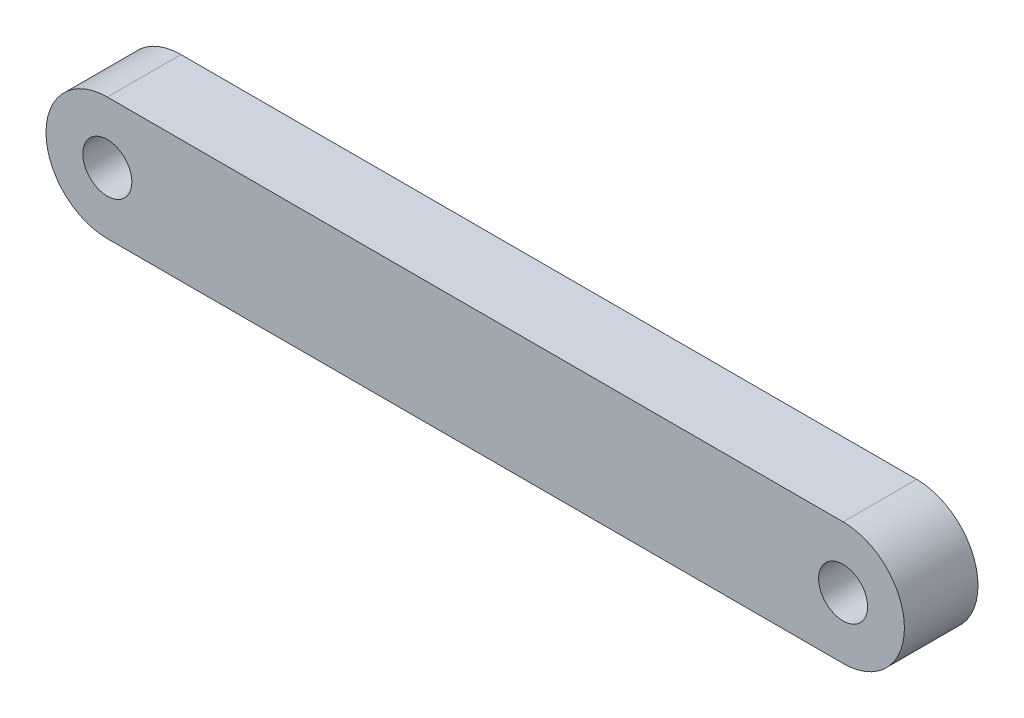
ISO-10303-21;
HEADER;
FILE_DESCRIPTION(('STEP AP214'),'2;1');
FILE_NAME('part.step','',(''),(''),'','','');
FILE_SCHEMA(('AUTOMOTIVE_DESIGN { 1 0 10303 214 1 1 1 1 }'));
ENDSEC;
DATA;
#1=APPLICATION_CONTEXT('core data for automotive mechanical design processes');
#2=APPLICATION_PROTOCOL_DEFINITION('international standard','automotive_design',2000,#1);
#3=PRODUCT_CONTEXT('',#1,'mechanical');
#4=PRODUCT('Part','Part','',(#3));
#5=PRODUCT_RELATED_PRODUCT_CATEGORY('part','',(#4));
#6=PRODUCT_DEFINITION_FORMATION('','',#4);
#7=PRODUCT_DEFINITION_CONTEXT('part definition',#1,'design');
#8=PRODUCT_DEFINITION('design','',#6,#7);
#9=PRODUCT_DEFINITION_SHAPE('','',#8);
#10=(LENGTH_UNIT() NAMED_UNIT(*) SI_UNIT(.MILLI.,.METRE.));
#11=(NAMED_UNIT(*) PLANE_ANGLE_UNIT() SI_UNIT($,.RADIAN.));
#12=(NAMED_UNIT(*) SI_UNIT($,.STERADIAN.) SOLID_ANGLE_UNIT());
#13=UNCERTAINTY_MEASURE_WITH_UNIT(LENGTH_MEASURE(1.E-05),#10,'distance_accuracy_value','');
#14=(GEOMETRIC_REPRESENTATION_CONTEXT(3) GLOBAL_UNCERTAINTY_ASSIGNED_CONTEXT((#13)) GLOBAL_UNIT_ASSIGNED_CONTEXT((#10,
#11,#12)) REPRESENTATION_CONTEXT('',''));
#15=CARTESIAN_POINT('',(0.,0.,0.));
#16=DIRECTION('',(0.,0.,1.));
#17=DIRECTION('',(1.,0.,0.));
#18=AXIS2_PLACEMENT_3D('',#15,#16,#17);
#19=CARTESIAN_POINT('',(0.,0.,3.));
#20=DIRECTION('',(0.,0.,1.));
#21=DIRECTION('',(1.,0.,0.));
#22=AXIS2_PLACEMENT_3D('',#19,#20,#21);
#23=PLANE('',#22);
#24=CARTESIAN_POINT('',(0.,0.,3.));
#25=DIRECTION('',(0.,0.,1.));
#26=DIRECTION('',(1.,0.,0.));
#27=AXIS2_PLACEMENT_3D('',#24,#25,#26);
#28=CIRCLE('',#27,1.);
#29=CARTESIAN_POINT('',(1.,0.,3.));
#30=VERTEX_POINT('',#29);
#31=EDGE_CURVE('E104',#30,#30,#28,.T.);
#32=ORIENTED_EDGE('',*,*,#31,.F.);
#33=EDGE_LOOP('',(#32));
#34=FACE_BOUND('',#33,.T.);
#35=CARTESIAN_POINT('',(0.,0.,3.));
#36=DIRECTION('',(0.,0.,1.));
#37=DIRECTION('',(1.,0.,0.));
#38=AXIS2_PLACEMENT_3D('',#35,#36,#37);
#39=CIRCLE('',#38,2.5);
#40=CARTESIAN_POINT('',(0.,2.5,3.));
#41=VERTEX_POINT('',#40);
#42=CARTESIAN_POINT('',(0.,-2.5,3.));
#43=VERTEX_POINT('',#42);
#44=EDGE_CURVE('E89',#41,#43,#39,.T.);
#45=ORIENTED_EDGE('',*,*,#44,.T.);
#46=DIRECTION('',(1.,0.,0.));
#47=VECTOR('',#46,1.);
#48=CARTESIAN_POINT('',(0.,-2.5,3.));
#49=LINE('',#48,#47);
#50=CARTESIAN_POINT('',(30.,-2.5,3.));
#51=VERTEX_POINT('',#50);
#52=EDGE_CURVE('E84',#43,#51,#49,.T.);
#53=ORIENTED_EDGE('',*,*,#52,.T.);
#54=CARTESIAN_POINT('',(30.,0.,3.));
#55=DIRECTION('',(0.,0.,1.));
#56=DIRECTION('',(1.,0.,0.));
#57=AXIS2_PLACEMENT_3D('',#54,#55,#56);
#58=CIRCLE('',#57,2.5);
#59=CARTESIAN_POINT('',(30.,2.5,3.));
#60=VERTEX_POINT('',#59);
#61=EDGE_CURVE('E87',#51,#60,#58,.T.);
#62=ORIENTED_EDGE('',*,*,#61,.T.);
#63=DIRECTION('',(-1.,0.,0.));
#64=VECTOR('',#63,1.);
#65=CARTESIAN_POINT('',(0.,2.5,3.));
#66=LINE('',#65,#64);
#67=EDGE_CURVE('E54',#60,#41,#66,.T.);
#68=ORIENTED_EDGE('',*,*,#67,.T.);
#69=EDGE_LOOP('',(#45,#53,#62,#68));
#70=FACE_BOUND('',#69,.T.);
#71=CARTESIAN_POINT('',(30.,0.,3.));
#72=DIRECTION('',(0.,0.,1.));
#73=DIRECTION('',(1.,0.,0.));
#74=AXIS2_PLACEMENT_3D('',#71,#72,#73);
#75=CIRCLE('',#74,1.);
#76=CARTESIAN_POINT('',(31.,0.,3.));
#77=VERTEX_POINT('',#76);
#78=EDGE_CURVE('E119',#77,#77,#75,.T.);
#79=ORIENTED_EDGE('',*,*,#78,.F.);
#80=EDGE_LOOP('',(#79));
#81=FACE_BOUND('',#80,.T.);
#82=ADVANCED_FACE('F37',(#34,#70,#81),#23,.T.);
#83=CARTESIAN_POINT('',(0.,0.,0.));
#84=DIRECTION('',(0.,0.,1.));
#85=DIRECTION('',(1.,0.,0.));
#86=AXIS2_PLACEMENT_3D('',#83,#84,#85);
#87=PLANE('',#86);
#88=CARTESIAN_POINT('',(0.,0.,0.));
#89=DIRECTION('',(0.,0.,1.));
#90=DIRECTION('',(1.,0.,0.));
#91=AXIS2_PLACEMENT_3D('',#88,#89,#90);
#92=CIRCLE('',#91,2.5);
#93=CARTESIAN_POINT('',(0.,2.5,0.));
#94=VERTEX_POINT('',#93);
#95=CARTESIAN_POINT('',(0.,-2.5,0.));
#96=VERTEX_POINT('',#95);
#97=EDGE_CURVE('E101',#94,#96,#92,.T.);
#98=ORIENTED_EDGE('',*,*,#97,.F.);
#99=DIRECTION('',(-1.,0.,0.));
#100=VECTOR('',#99,1.);
#101=CARTESIAN_POINT('',(0.,2.5,0.));
#102=LINE('',#101,#100);
#103=CARTESIAN_POINT('',(30.,2.5,0.));
#104=VERTEX_POINT('',#103);
#105=EDGE_CURVE('E77',#104,#94,#102,.T.);
#106=ORIENTED_EDGE('',*,*,#105,.F.);
#107=CARTESIAN_POINT('',(30.,0.,0.));
#108=DIRECTION('',(0.,0.,1.));
#109=DIRECTION('',(1.,0.,0.));
#110=AXIS2_PLACEMENT_3D('',#107,#108,#109);
#111=CIRCLE('',#110,2.5);
#112=CARTESIAN_POINT('',(30.,-2.5,0.));
#113=VERTEX_POINT('',#112);
#114=EDGE_CURVE('E71',#113,#104,#111,.T.);
#115=ORIENTED_EDGE('',*,*,#114,.F.);
#116=DIRECTION('',(1.,0.,0.));
#117=VECTOR('',#116,1.);
#118=CARTESIAN_POINT('',(0.,-2.5,0.));
#119=LINE('',#118,#117);
#120=EDGE_CURVE('E93',#96,#113,#119,.T.);
#121=ORIENTED_EDGE('',*,*,#120,.F.);
#122=EDGE_LOOP('',(#98,#106,#115,#121));
#123=FACE_BOUND('',#122,.T.);
#124=CARTESIAN_POINT('',(0.,0.,0.));
#125=DIRECTION('',(0.,0.,1.));
#126=DIRECTION('',(1.,0.,0.));
#127=AXIS2_PLACEMENT_3D('',#124,#125,#126);
#128=CIRCLE('',#127,1.);
#129=CARTESIAN_POINT('',(1.,0.,0.));
#130=VERTEX_POINT('',#129);
#131=EDGE_CURVE('E116',#130,#130,#128,.T.);
#132=ORIENTED_EDGE('',*,*,#131,.T.);
#133=EDGE_LOOP('',(#132));
#134=FACE_BOUND('',#133,.T.);
#135=CARTESIAN_POINT('',(30.,0.,0.));
#136=DIRECTION('',(0.,0.,1.));
#137=DIRECTION('',(1.,0.,0.));
#138=AXIS2_PLACEMENT_3D('',#135,#136,#137);
#139=CIRCLE('',#138,1.);
#140=CARTESIAN_POINT('',(31.,0.,0.));
#141=VERTEX_POINT('',#140);
#142=EDGE_CURVE('E122',#141,#141,#139,.T.);
#143=ORIENTED_EDGE('',*,*,#142,.T.);
#144=EDGE_LOOP('',(#143));
#145=FACE_BOUND('',#144,.T.);
#146=ADVANCED_FACE('F112',(#123,#134,#145),#87,.F.);
#147=CARTESIAN_POINT('',(0.,0.,3.));
#148=DIRECTION('',(0.,0.,-1.));
#149=DIRECTION('',(-1.,0.,0.));
#150=AXIS2_PLACEMENT_3D('',#147,#148,#149);
#151=CYLINDRICAL_SURFACE('',#150,2.5);
#152=ORIENTED_EDGE('',*,*,#97,.T.);
#153=DIRECTION('',(0.,0.,-1.));
#154=VECTOR('',#153,1.);
#155=CARTESIAN_POINT('',(0.,-2.5,3.));
#156=LINE('',#155,#154);
#157=EDGE_CURVE('E11',#43,#96,#156,.T.);
#158=ORIENTED_EDGE('',*,*,#157,.F.);
#159=ORIENTED_EDGE('',*,*,#44,.F.);
#160=DIRECTION('',(0.,0.,-1.));
#161=VECTOR('',#160,1.);
#162=CARTESIAN_POINT('',(0.,2.5,3.));
#163=LINE('',#162,#161);
#164=EDGE_CURVE('E97',#41,#94,#163,.T.);
#165=ORIENTED_EDGE('',*,*,#164,.T.);
#166=EDGE_LOOP('',(#152,#158,#159,#165));
#167=FACE_BOUND('',#166,.T.);
#168=ADVANCED_FACE('F39',(#167),#151,.T.);
#169=CARTESIAN_POINT('',(0.,-2.5,3.));
#170=DIRECTION('',(0.,1.,0.));
#171=DIRECTION('',(-1.,0.,0.));
#172=AXIS2_PLACEMENT_3D('',#169,#170,#171);
#173=PLANE('',#172);
#174=ORIENTED_EDGE('',*,*,#120,.T.);
#175=DIRECTION('',(0.,0.,-1.));
#176=VECTOR('',#175,1.);
#177=CARTESIAN_POINT('',(30.,-2.5,3.));
#178=LINE('',#177,#176);
#179=EDGE_CURVE('E46',#51,#113,#178,.T.);
#180=ORIENTED_EDGE('',*,*,#179,.F.);
#181=ORIENTED_EDGE('',*,*,#52,.F.);
#182=ORIENTED_EDGE('',*,*,#157,.T.);
#183=EDGE_LOOP('',(#174,#180,#181,#182));
#184=FACE_BOUND('',#183,.T.);
#185=ADVANCED_FACE('F92',(#184),#173,.F.);
#186=CARTESIAN_POINT('',(30.,0.,3.));
#187=DIRECTION('',(0.,0.,-1.));
#188=DIRECTION('',(-1.,0.,0.));
#189=AXIS2_PLACEMENT_3D('',#186,#187,#188);
#190=CYLINDRICAL_SURFACE('',#189,2.5);
#191=ORIENTED_EDGE('',*,*,#114,.T.);
#192=DIRECTION('',(0.,0.,-1.));
#193=VECTOR('',#192,1.);
#194=CARTESIAN_POINT('',(30.,2.5,3.));
#195=LINE('',#194,#193);
#196=EDGE_CURVE('E94',#60,#104,#195,.T.);
#197=ORIENTED_EDGE('',*,*,#196,.F.);
#198=ORIENTED_EDGE('',*,*,#61,.F.);
#199=ORIENTED_EDGE('',*,*,#179,.T.);
#200=EDGE_LOOP('',(#191,#197,#198,#199));
#201=FACE_BOUND('',#200,.T.);
#202=ADVANCED_FACE('F95',(#201),#190,.T.);
#203=CARTESIAN_POINT('',(0.,2.5,3.));
#204=DIRECTION('',(0.,-1.,0.));
#205=DIRECTION('',(1.,0.,0.));
#206=AXIS2_PLACEMENT_3D('',#203,#204,#205);
#207=PLANE('',#206);
#208=ORIENTED_EDGE('',*,*,#105,.T.);
#209=ORIENTED_EDGE('',*,*,#164,.F.);
#210=ORIENTED_EDGE('',*,*,#67,.F.);
#211=ORIENTED_EDGE('',*,*,#196,.T.);
#212=EDGE_LOOP('',(#208,#209,#210,#211));
#213=FACE_BOUND('',#212,.T.);
#214=ADVANCED_FACE('F109',(#213),#207,.F.);
#215=CARTESIAN_POINT('',(0.,0.,3.));
#216=DIRECTION('',(0.,0.,-1.));
#217=DIRECTION('',(-1.,0.,0.));
#218=AXIS2_PLACEMENT_3D('',#215,#216,#217);
#219=CYLINDRICAL_SURFACE('',#218,1.);
#220=ORIENTED_EDGE('',*,*,#31,.T.);
#221=EDGE_LOOP('',(#220));
#222=FACE_BOUND('',#221,.T.);
#223=ORIENTED_EDGE('',*,*,#131,.F.);
#224=EDGE_LOOP('',(#223));
#225=FACE_BOUND('',#224,.T.);
#226=ADVANCED_FACE('F139',(#222,#225),#219,.F.);
#227=CARTESIAN_POINT('',(30.,0.,3.));
#228=DIRECTION('',(0.,0.,-1.));
#229=DIRECTION('',(-1.,0.,0.));
#230=AXIS2_PLACEMENT_3D('',#227,#228,#229);
#231=CYLINDRICAL_SURFACE('',#230,1.);
#232=ORIENTED_EDGE('',*,*,#78,.T.);
#233=EDGE_LOOP('',(#232));
#234=FACE_BOUND('',#233,.T.);
#235=ORIENTED_EDGE('',*,*,#142,.F.);
#236=EDGE_LOOP('',(#235));
#237=FACE_BOUND('',#236,.T.);
#238=ADVANCED_FACE('F128',(#234,#237),#231,.F.);
#239=CLOSED_SHELL('',(#82,#146,#168,#185,#202,#214,#226,#238));
#240=MANIFOLD_SOLID_BREP('B2',#239);
#241=ADVANCED_BREP_SHAPE_REPRESENTATION('',(#18,#240),#14);
#242=SHAPE_DEFINITION_REPRESENTATION(#9,#241);
ENDSEC;
END-ISO-10303-21;
